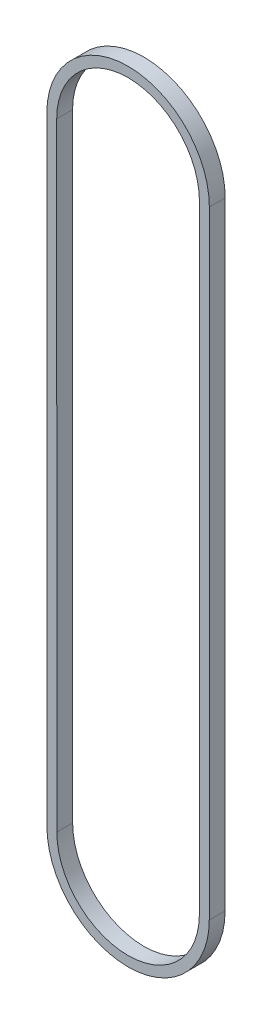
ISO-10303-21;
HEADER;
FILE_DESCRIPTION(('STEP AP214'),'2;1');
FILE_NAME('part.step','',(''),(''),'','','');
FILE_SCHEMA(('AUTOMOTIVE_DESIGN { 1 0 10303 214 1 1 1 1 }'));
ENDSEC;
DATA;
#1=APPLICATION_CONTEXT('core data for automotive mechanical design processes');
#2=APPLICATION_PROTOCOL_DEFINITION('international standard','automotive_design',2000,#1);
#3=PRODUCT_CONTEXT('',#1,'mechanical');
#4=PRODUCT('Part','Part','',(#3));
#5=PRODUCT_RELATED_PRODUCT_CATEGORY('part','',(#4));
#6=PRODUCT_DEFINITION_FORMATION('','',#4);
#7=PRODUCT_DEFINITION_CONTEXT('part definition',#1,'design');
#8=PRODUCT_DEFINITION('design','',#6,#7);
#9=PRODUCT_DEFINITION_SHAPE('','',#8);
#10=(LENGTH_UNIT() NAMED_UNIT(*) SI_UNIT(.MILLI.,.METRE.));
#11=(NAMED_UNIT(*) PLANE_ANGLE_UNIT() SI_UNIT($,.RADIAN.));
#12=(NAMED_UNIT(*) SI_UNIT($,.STERADIAN.) SOLID_ANGLE_UNIT());
#13=UNCERTAINTY_MEASURE_WITH_UNIT(LENGTH_MEASURE(1.E-05),#10,'distance_accuracy_value','');
#14=(GEOMETRIC_REPRESENTATION_CONTEXT(3) GLOBAL_UNCERTAINTY_ASSIGNED_CONTEXT((#13)) GLOBAL_UNIT_ASSIGNED_CONTEXT((#10,
#11,#12)) REPRESENTATION_CONTEXT('',''));
#15=CARTESIAN_POINT('',(0.,0.,0.));
#16=DIRECTION('',(0.,0.,1.));
#17=DIRECTION('',(1.,0.,0.));
#18=AXIS2_PLACEMENT_3D('',#15,#16,#17);
#19=CARTESIAN_POINT('',(-5.45723437081898,-32.5822053554605,4.064));
#20=DIRECTION('',(0.,0.,1.));
#21=DIRECTION('',(1.,0.,0.));
#22=AXIS2_PLACEMENT_3D('',#19,#20,#21);
#23=PLANE('',#22);
#24=CARTESIAN_POINT('',(-5.45723437081898,-32.5822053554605,4.064));
#25=DIRECTION('',(0.,0.,1.));
#26=DIRECTION('',(1.,0.,0.));
#27=AXIS2_PLACEMENT_3D('',#24,#25,#26);
#28=CIRCLE('',#27,20.828);
#29=CARTESIAN_POINT('',(-26.2852341033226,-32.5855434434483,4.064));
#30=VERTEX_POINT('',#29);
#31=CARTESIAN_POINT('',(15.3707653616846,-32.5855434434483,4.064));
#32=VERTEX_POINT('',#31);
#33=EDGE_CURVE('E133',#30,#32,#28,.T.);
#34=ORIENTED_EDGE('',*,*,#33,.T.);
#35=DIRECTION('',(0.00016026925234393,0.999999987156883,0.));
#36=VECTOR('',#35,1.);
#37=CARTESIAN_POINT('',(15.3961653613584,125.897752485713,4.064));
#38=LINE('',#37,#36);
#39=CARTESIAN_POINT('',(15.3961653613584,125.897752485713,4.064));
#40=VERTEX_POINT('',#39);
#41=EDGE_CURVE('E136',#32,#40,#38,.T.);
#42=ORIENTED_EDGE('',*,*,#41,.T.);
#43=CARTESIAN_POINT('',(-5.45723437081898,125.901094644539,4.064));
#44=DIRECTION('',(0.,0.,1.));
#45=DIRECTION('',(1.,0.,0.));
#46=AXIS2_PLACEMENT_3D('',#43,#44,#45);
#47=CIRCLE('',#46,20.8534);
#48=CARTESIAN_POINT('',(-26.3106341029963,125.897752485713,4.064));
#49=VERTEX_POINT('',#48);
#50=EDGE_CURVE('E139',#40,#49,#47,.T.);
#51=ORIENTED_EDGE('',*,*,#50,.T.);
#52=DIRECTION('',(0.00016026925234393,-0.999999987156883,0.));
#53=VECTOR('',#52,1.);
#54=CARTESIAN_POINT('',(-26.3106341029963,125.897752485713,4.064));
#55=LINE('',#54,#53);
#56=EDGE_CURVE('E141',#49,#30,#55,.T.);
#57=ORIENTED_EDGE('',*,*,#56,.T.);
#58=EDGE_LOOP('',(#34,#42,#51,#57));
#59=FACE_BOUND('',#58,.T.);
#60=DIRECTION('',(0.00016026925234393,-0.999999987156883,0.));
#61=VECTOR('',#60,1.);
#62=CARTESIAN_POINT('',(-23.7706341356178,125.898159569614,4.064));
#63=LINE('',#62,#61);
#64=CARTESIAN_POINT('',(-23.7706341356178,125.898159569614,4.064));
#65=VERTEX_POINT('',#64);
#66=CARTESIAN_POINT('',(-23.7452341359441,-32.5851363595474,4.064));
#67=VERTEX_POINT('',#66);
#68=EDGE_CURVE('E105',#65,#67,#63,.T.);
#69=ORIENTED_EDGE('',*,*,#68,.F.);
#70=CARTESIAN_POINT('',(-5.45723437081898,125.901094644539,4.064));
#71=DIRECTION('',(0.,0.,1.));
#72=DIRECTION('',(1.,0.,0.));
#73=AXIS2_PLACEMENT_3D('',#70,#71,#72);
#74=CIRCLE('',#73,18.3134);
#75=CARTESIAN_POINT('',(12.8561653939799,125.898159569614,4.064));
#76=VERTEX_POINT('',#75);
#77=EDGE_CURVE('E97',#76,#65,#74,.T.);
#78=ORIENTED_EDGE('',*,*,#77,.F.);
#79=DIRECTION('',(0.000160269252343985,0.999999987156883,0.));
#80=VECTOR('',#79,1.);
#81=CARTESIAN_POINT('',(12.8561653939799,125.898159569614,4.064));
#82=LINE('',#81,#80);
#83=CARTESIAN_POINT('',(12.8307653943061,-32.5851363595474,4.064));
#84=VERTEX_POINT('',#83);
#85=EDGE_CURVE('E119',#84,#76,#82,.T.);
#86=ORIENTED_EDGE('',*,*,#85,.F.);
#87=CARTESIAN_POINT('',(-5.45723437081898,-32.5822053554605,4.064));
#88=DIRECTION('',(0.,0.,1.));
#89=DIRECTION('',(1.,0.,0.));
#90=AXIS2_PLACEMENT_3D('',#87,#88,#89);
#91=CIRCLE('',#90,18.288);
#92=EDGE_CURVE('E117',#67,#84,#91,.T.);
#93=ORIENTED_EDGE('',*,*,#92,.F.);
#94=EDGE_LOOP('',(#69,#78,#86,#93));
#95=FACE_BOUND('',#94,.T.);
#96=ADVANCED_FACE('F32',(#59,#95),#23,.T.);
#97=CARTESIAN_POINT('',(-5.45723437081898,-32.5822053554605,0.));
#98=DIRECTION('',(0.,0.,1.));
#99=DIRECTION('',(1.,0.,0.));
#100=AXIS2_PLACEMENT_3D('',#97,#98,#99);
#101=PLANE('',#100);
#102=CARTESIAN_POINT('',(-5.45723437081898,-32.5822053554605,0.));
#103=DIRECTION('',(0.,0.,1.));
#104=DIRECTION('',(1.,0.,0.));
#105=AXIS2_PLACEMENT_3D('',#102,#103,#104);
#106=CIRCLE('',#105,20.828);
#107=CARTESIAN_POINT('',(-26.2852341033226,-32.5855434434483,0.));
#108=VERTEX_POINT('',#107);
#109=CARTESIAN_POINT('',(15.3707653616846,-32.5855434434483,0.));
#110=VERTEX_POINT('',#109);
#111=EDGE_CURVE('E113',#108,#110,#106,.T.);
#112=ORIENTED_EDGE('',*,*,#111,.F.);
#113=DIRECTION('',(0.00016026925234393,-0.999999987156883,0.));
#114=VECTOR('',#113,1.);
#115=CARTESIAN_POINT('',(-26.3106341029963,125.897752485713,0.));
#116=LINE('',#115,#114);
#117=CARTESIAN_POINT('',(-26.3106341029963,125.897752485713,0.));
#118=VERTEX_POINT('',#117);
#119=EDGE_CURVE('E137',#118,#108,#116,.T.);
#120=ORIENTED_EDGE('',*,*,#119,.F.);
#121=CARTESIAN_POINT('',(-5.45723437081898,125.901094644539,0.));
#122=DIRECTION('',(0.,0.,1.));
#123=DIRECTION('',(1.,0.,0.));
#124=AXIS2_PLACEMENT_3D('',#121,#122,#123);
#125=CIRCLE('',#124,20.8534);
#126=CARTESIAN_POINT('',(15.3961653613584,125.897752485713,0.));
#127=VERTEX_POINT('',#126);
#128=EDGE_CURVE('E148',#127,#118,#125,.T.);
#129=ORIENTED_EDGE('',*,*,#128,.F.);
#130=DIRECTION('',(0.00016026925234393,0.999999987156883,0.));
#131=VECTOR('',#130,1.);
#132=CARTESIAN_POINT('',(15.3961653613584,125.897752485713,0.));
#133=LINE('',#132,#131);
#134=EDGE_CURVE('E146',#110,#127,#133,.T.);
#135=ORIENTED_EDGE('',*,*,#134,.F.);
#136=EDGE_LOOP('',(#112,#120,#129,#135));
#137=FACE_BOUND('',#136,.T.);
#138=CARTESIAN_POINT('',(-5.45723437081898,125.901094644539,0.));
#139=DIRECTION('',(0.,0.,1.));
#140=DIRECTION('',(1.,0.,0.));
#141=AXIS2_PLACEMENT_3D('',#138,#139,#140);
#142=CIRCLE('',#141,18.3134);
#143=CARTESIAN_POINT('',(12.8561653939799,125.898159569614,0.));
#144=VERTEX_POINT('',#143);
#145=CARTESIAN_POINT('',(-23.7706341356178,125.898159569614,0.));
#146=VERTEX_POINT('',#145);
#147=EDGE_CURVE('E55',#144,#146,#142,.T.);
#148=ORIENTED_EDGE('',*,*,#147,.T.);
#149=DIRECTION('',(0.00016026925234393,-0.999999987156883,0.));
#150=VECTOR('',#149,1.);
#151=CARTESIAN_POINT('',(-23.7706341356178,125.898159569614,0.));
#152=LINE('',#151,#150);
#153=CARTESIAN_POINT('',(-23.7452341359441,-32.5851363595474,0.));
#154=VERTEX_POINT('',#153);
#155=EDGE_CURVE('E112',#146,#154,#152,.T.);
#156=ORIENTED_EDGE('',*,*,#155,.T.);
#157=CARTESIAN_POINT('',(-5.45723437081898,-32.5822053554605,0.));
#158=DIRECTION('',(0.,0.,1.));
#159=DIRECTION('',(1.,0.,0.));
#160=AXIS2_PLACEMENT_3D('',#157,#158,#159);
#161=CIRCLE('',#160,18.288);
#162=CARTESIAN_POINT('',(12.8307653943061,-32.5851363595474,0.));
#163=VERTEX_POINT('',#162);
#164=EDGE_CURVE('E125',#154,#163,#161,.T.);
#165=ORIENTED_EDGE('',*,*,#164,.T.);
#166=DIRECTION('',(0.000160269252343985,0.999999987156883,0.));
#167=VECTOR('',#166,1.);
#168=CARTESIAN_POINT('',(12.8561653939799,125.898159569614,0.));
#169=LINE('',#168,#167);
#170=EDGE_CURVE('E106',#163,#144,#169,.T.);
#171=ORIENTED_EDGE('',*,*,#170,.T.);
#172=EDGE_LOOP('',(#148,#156,#165,#171));
#173=FACE_BOUND('',#172,.T.);
#174=ADVANCED_FACE('F166',(#137,#173),#101,.F.);
#175=CARTESIAN_POINT('',(-5.45723437081898,-32.5822053554605,4.064));
#176=DIRECTION('',(0.,0.,-1.));
#177=DIRECTION('',(-1.,0.,0.));
#178=AXIS2_PLACEMENT_3D('',#175,#176,#177);
#179=CYLINDRICAL_SURFACE('',#178,20.828);
#180=ORIENTED_EDGE('',*,*,#111,.T.);
#181=DIRECTION('',(0.,0.,-1.));
#182=VECTOR('',#181,1.);
#183=CARTESIAN_POINT('',(15.3707653616846,-32.5855434434483,4.064));
#184=LINE('',#183,#182);
#185=EDGE_CURVE('E11',#32,#110,#184,.T.);
#186=ORIENTED_EDGE('',*,*,#185,.F.);
#187=ORIENTED_EDGE('',*,*,#33,.F.);
#188=DIRECTION('',(0.,0.,-1.));
#189=VECTOR('',#188,1.);
#190=CARTESIAN_POINT('',(-26.2852341033226,-32.5855434434483,4.064));
#191=LINE('',#190,#189);
#192=EDGE_CURVE('E143',#30,#108,#191,.T.);
#193=ORIENTED_EDGE('',*,*,#192,.T.);
#194=EDGE_LOOP('',(#180,#186,#187,#193));
#195=FACE_BOUND('',#194,.T.);
#196=ADVANCED_FACE('F34',(#195),#179,.T.);
#197=CARTESIAN_POINT('',(15.3961653613584,125.897752485713,4.064));
#198=DIRECTION('',(-0.999999987156883,0.00016026925234393,0.));
#199=DIRECTION('',(-0.00016026925234393,-0.999999987156883,0.));
#200=AXIS2_PLACEMENT_3D('',#197,#198,#199);
#201=PLANE('',#200);
#202=ORIENTED_EDGE('',*,*,#134,.T.);
#203=DIRECTION('',(0.,0.,-1.));
#204=VECTOR('',#203,1.);
#205=CARTESIAN_POINT('',(15.3961653613584,125.897752485713,4.064));
#206=LINE('',#205,#204);
#207=EDGE_CURVE('E40',#40,#127,#206,.T.);
#208=ORIENTED_EDGE('',*,*,#207,.F.);
#209=ORIENTED_EDGE('',*,*,#41,.F.);
#210=ORIENTED_EDGE('',*,*,#185,.T.);
#211=EDGE_LOOP('',(#202,#208,#209,#210));
#212=FACE_BOUND('',#211,.T.);
#213=ADVANCED_FACE('F176',(#212),#201,.F.);
#214=CARTESIAN_POINT('',(-5.45723437081898,125.901094644539,4.064));
#215=DIRECTION('',(0.,0.,-1.));
#216=DIRECTION('',(-1.,0.,0.));
#217=AXIS2_PLACEMENT_3D('',#214,#215,#216);
#218=CYLINDRICAL_SURFACE('',#217,20.8534);
#219=ORIENTED_EDGE('',*,*,#128,.T.);
#220=DIRECTION('',(0.,0.,-1.));
#221=VECTOR('',#220,1.);
#222=CARTESIAN_POINT('',(-26.3106341029963,125.897752485713,4.064));
#223=LINE('',#222,#221);
#224=EDGE_CURVE('E153',#49,#118,#223,.T.);
#225=ORIENTED_EDGE('',*,*,#224,.F.);
#226=ORIENTED_EDGE('',*,*,#50,.F.);
#227=ORIENTED_EDGE('',*,*,#207,.T.);
#228=EDGE_LOOP('',(#219,#225,#226,#227));
#229=FACE_BOUND('',#228,.T.);
#230=ADVANCED_FACE('F160',(#229),#218,.T.);
#231=CARTESIAN_POINT('',(-26.3106341029963,125.897752485713,4.064));
#232=DIRECTION('',(0.999999987156883,0.00016026925234393,0.));
#233=DIRECTION('',(-0.00016026925234393,0.999999987156883,0.));
#234=AXIS2_PLACEMENT_3D('',#231,#232,#233);
#235=PLANE('',#234);
#236=ORIENTED_EDGE('',*,*,#119,.T.);
#237=ORIENTED_EDGE('',*,*,#192,.F.);
#238=ORIENTED_EDGE('',*,*,#56,.F.);
#239=ORIENTED_EDGE('',*,*,#224,.T.);
#240=EDGE_LOOP('',(#236,#237,#238,#239));
#241=FACE_BOUND('',#240,.T.);
#242=ADVANCED_FACE('F170',(#241),#235,.F.);
#243=CARTESIAN_POINT('',(-5.45723437081898,125.901094644539,4.064));
#244=DIRECTION('',(0.,0.,-1.));
#245=DIRECTION('',(-1.,0.,0.));
#246=AXIS2_PLACEMENT_3D('',#243,#244,#245);
#247=CYLINDRICAL_SURFACE('',#246,18.3134);
#248=ORIENTED_EDGE('',*,*,#147,.F.);
#249=DIRECTION('',(0.,0.,-1.));
#250=VECTOR('',#249,1.);
#251=CARTESIAN_POINT('',(12.8561653939799,125.898159569614,4.064));
#252=LINE('',#251,#250);
#253=EDGE_CURVE('E101',#76,#144,#252,.T.);
#254=ORIENTED_EDGE('',*,*,#253,.F.);
#255=ORIENTED_EDGE('',*,*,#77,.T.);
#256=DIRECTION('',(0.,0.,-1.));
#257=VECTOR('',#256,1.);
#258=CARTESIAN_POINT('',(-23.7706341356178,125.898159569614,4.064));
#259=LINE('',#258,#257);
#260=EDGE_CURVE('E100',#65,#146,#259,.T.);
#261=ORIENTED_EDGE('',*,*,#260,.T.);
#262=EDGE_LOOP('',(#248,#254,#255,#261));
#263=FACE_BOUND('',#262,.T.);
#264=ADVANCED_FACE('F99',(#263),#247,.F.);
#265=CARTESIAN_POINT('',(-23.7706341356178,125.898159569614,4.064));
#266=DIRECTION('',(0.999999987156883,0.00016026925234393,0.));
#267=DIRECTION('',(-0.00016026925234393,0.999999987156883,0.));
#268=AXIS2_PLACEMENT_3D('',#265,#266,#267);
#269=PLANE('',#268);
#270=ORIENTED_EDGE('',*,*,#155,.F.);
#271=ORIENTED_EDGE('',*,*,#260,.F.);
#272=ORIENTED_EDGE('',*,*,#68,.T.);
#273=DIRECTION('',(0.,0.,-1.));
#274=VECTOR('',#273,1.);
#275=CARTESIAN_POINT('',(-23.7452341359441,-32.5851363595474,4.064));
#276=LINE('',#275,#274);
#277=EDGE_CURVE('E114',#67,#154,#276,.T.);
#278=ORIENTED_EDGE('',*,*,#277,.T.);
#279=EDGE_LOOP('',(#270,#271,#272,#278));
#280=FACE_BOUND('',#279,.T.);
#281=ADVANCED_FACE('F109',(#280),#269,.T.);
#282=CARTESIAN_POINT('',(-5.45723437081898,-32.5822053554605,4.064));
#283=DIRECTION('',(0.,0.,-1.));
#284=DIRECTION('',(-1.,0.,0.));
#285=AXIS2_PLACEMENT_3D('',#282,#283,#284);
#286=CYLINDRICAL_SURFACE('',#285,18.288);
#287=ORIENTED_EDGE('',*,*,#164,.F.);
#288=ORIENTED_EDGE('',*,*,#277,.F.);
#289=ORIENTED_EDGE('',*,*,#92,.T.);
#290=DIRECTION('',(0.,0.,-1.));
#291=VECTOR('',#290,1.);
#292=CARTESIAN_POINT('',(12.8307653943061,-32.5851363595474,4.064));
#293=LINE('',#292,#291);
#294=EDGE_CURVE('E47',#84,#163,#293,.T.);
#295=ORIENTED_EDGE('',*,*,#294,.T.);
#296=EDGE_LOOP('',(#287,#288,#289,#295));
#297=FACE_BOUND('',#296,.T.);
#298=ADVANCED_FACE('F199',(#297),#286,.F.);
#299=CARTESIAN_POINT('',(12.8561653939799,125.898159569614,4.064));
#300=DIRECTION('',(-0.999999987156883,0.000160269252343985,0.));
#301=DIRECTION('',(-0.000160269252343985,-0.999999987156883,0.));
#302=AXIS2_PLACEMENT_3D('',#299,#300,#301);
#303=PLANE('',#302);
#304=ORIENTED_EDGE('',*,*,#170,.F.);
#305=ORIENTED_EDGE('',*,*,#294,.F.);
#306=ORIENTED_EDGE('',*,*,#85,.T.);
#307=ORIENTED_EDGE('',*,*,#253,.T.);
#308=EDGE_LOOP('',(#304,#305,#306,#307));
#309=FACE_BOUND('',#308,.T.);
#310=ADVANCED_FACE('F203',(#309),#303,.T.);
#311=CLOSED_SHELL('',(#96,#174,#196,#213,#230,#242,#264,#281,#298,#310));
#312=MANIFOLD_SOLID_BREP('B2',#311);
#313=ADVANCED_BREP_SHAPE_REPRESENTATION('',(#18,#312),#14);
#314=SHAPE_DEFINITION_REPRESENTATION(#9,#313);
ENDSEC;
END-ISO-10303-21;
